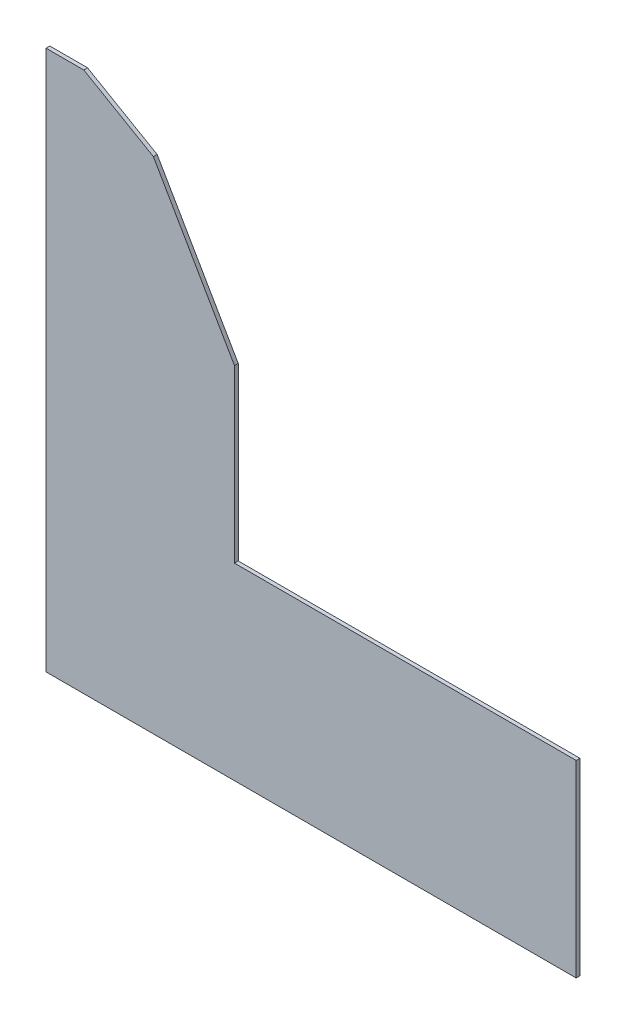
ISO-10303-21;
HEADER;
FILE_DESCRIPTION(('STEP AP214'),'2;1');
FILE_NAME('part.step','',(''),(''),'','','');
FILE_SCHEMA(('AUTOMOTIVE_DESIGN { 1 0 10303 214 1 1 1 1 }'));
ENDSEC;
DATA;
#1=APPLICATION_CONTEXT('core data for automotive mechanical design processes');
#2=APPLICATION_PROTOCOL_DEFINITION('international standard','automotive_design',2000,#1);
#3=PRODUCT_CONTEXT('',#1,'mechanical');
#4=PRODUCT('Part','Part','',(#3));
#5=PRODUCT_RELATED_PRODUCT_CATEGORY('part','',(#4));
#6=PRODUCT_DEFINITION_FORMATION('','',#4);
#7=PRODUCT_DEFINITION_CONTEXT('part definition',#1,'design');
#8=PRODUCT_DEFINITION('design','',#6,#7);
#9=PRODUCT_DEFINITION_SHAPE('','',#8);
#10=(LENGTH_UNIT() NAMED_UNIT(*) SI_UNIT(.MILLI.,.METRE.));
#11=(NAMED_UNIT(*) PLANE_ANGLE_UNIT() SI_UNIT($,.RADIAN.));
#12=(NAMED_UNIT(*) SI_UNIT($,.STERADIAN.) SOLID_ANGLE_UNIT());
#13=UNCERTAINTY_MEASURE_WITH_UNIT(LENGTH_MEASURE(1.E-05),#10,'distance_accuracy_value','');
#14=(GEOMETRIC_REPRESENTATION_CONTEXT(3) GLOBAL_UNCERTAINTY_ASSIGNED_CONTEXT((#13)) GLOBAL_UNIT_ASSIGNED_CONTEXT((#10,
#11,#12)) REPRESENTATION_CONTEXT('',''));
#15=CARTESIAN_POINT('',(0.,0.,0.));
#16=DIRECTION('',(0.,0.,1.));
#17=DIRECTION('',(1.,0.,0.));
#18=AXIS2_PLACEMENT_3D('',#15,#16,#17);
#19=CARTESIAN_POINT('',(0.,0.,1.5));
#20=DIRECTION('',(0.,-1.,0.));
#21=DIRECTION('',(0.,0.,-1.));
#22=AXIS2_PLACEMENT_3D('',#19,#20,#21);
#23=PLANE('',#22);
#24=DIRECTION('',(0.,0.,-1.));
#25=VECTOR('',#24,1.);
#26=CARTESIAN_POINT('',(75.,0.,160.323801742686));
#27=LINE('',#26,#25);
#28=CARTESIAN_POINT('',(75.,0.,1.5));
#29=VERTEX_POINT('',#28);
#30=CARTESIAN_POINT('',(75.,0.,0.));
#31=VERTEX_POINT('',#30);
#32=EDGE_CURVE('E47',#29,#31,#27,.T.);
#33=ORIENTED_EDGE('',*,*,#32,.F.);
#34=DIRECTION('',(-1.,0.,0.));
#35=VECTOR('',#34,1.);
#36=CARTESIAN_POINT('',(0.,0.,1.5));
#37=LINE('',#36,#35);
#38=CARTESIAN_POINT('',(211.,0.,1.5));
#39=VERTEX_POINT('',#38);
#40=EDGE_CURVE('E111',#39,#29,#37,.T.);
#41=ORIENTED_EDGE('',*,*,#40,.F.);
#42=DIRECTION('',(0.,0.,-1.));
#43=VECTOR('',#42,1.);
#44=CARTESIAN_POINT('',(211.,0.,1.5));
#45=LINE('',#44,#43);
#46=CARTESIAN_POINT('',(211.,0.,0.));
#47=VERTEX_POINT('',#46);
#48=EDGE_CURVE('E149',#39,#47,#45,.T.);
#49=ORIENTED_EDGE('',*,*,#48,.T.);
#50=DIRECTION('',(-1.,0.,0.));
#51=VECTOR('',#50,1.);
#52=CARTESIAN_POINT('',(0.,0.,0.));
#53=LINE('',#52,#51);
#54=EDGE_CURVE('E125',#47,#31,#53,.T.);
#55=ORIENTED_EDGE('',*,*,#54,.T.);
#56=EDGE_LOOP('',(#33,#41,#49,#55));
#57=FACE_BOUND('',#56,.T.);
#58=ADVANCED_FACE('F33',(#57),#23,.F.);
#59=CARTESIAN_POINT('',(0.,0.,1.5));
#60=DIRECTION('',(1.,0.,0.));
#61=DIRECTION('',(0.,1.,0.));
#62=AXIS2_PLACEMENT_3D('',#59,#60,#61);
#63=PLANE('',#62);
#64=DIRECTION('',(0.,-1.,0.));
#65=VECTOR('',#64,1.);
#66=CARTESIAN_POINT('',(0.,0.,0.));
#67=LINE('',#66,#65);
#68=CARTESIAN_POINT('',(0.,140.,0.));
#69=VERTEX_POINT('',#68);
#70=CARTESIAN_POINT('',(0.,-75.,0.));
#71=VERTEX_POINT('',#70);
#72=EDGE_CURVE('E127',#69,#71,#67,.T.);
#73=ORIENTED_EDGE('',*,*,#72,.T.);
#74=DIRECTION('',(0.,0.,-1.));
#75=VECTOR('',#74,1.);
#76=CARTESIAN_POINT('',(0.,-75.,1.5));
#77=LINE('',#76,#75);
#78=CARTESIAN_POINT('',(0.,-75.,1.5));
#79=VERTEX_POINT('',#78);
#80=EDGE_CURVE('E11',#79,#71,#77,.T.);
#81=ORIENTED_EDGE('',*,*,#80,.F.);
#82=DIRECTION('',(0.,-1.,0.));
#83=VECTOR('',#82,1.);
#84=CARTESIAN_POINT('',(0.,0.,1.5));
#85=LINE('',#84,#83);
#86=CARTESIAN_POINT('',(0.,140.,1.5));
#87=VERTEX_POINT('',#86);
#88=EDGE_CURVE('E77',#87,#79,#85,.T.);
#89=ORIENTED_EDGE('',*,*,#88,.F.);
#90=DIRECTION('',(0.,0.,-1.));
#91=VECTOR('',#90,1.);
#92=CARTESIAN_POINT('',(0.,140.,160.323801742686));
#93=LINE('',#92,#91);
#94=EDGE_CURVE('E107',#87,#69,#93,.T.);
#95=ORIENTED_EDGE('',*,*,#94,.T.);
#96=EDGE_LOOP('',(#73,#81,#89,#95));
#97=FACE_BOUND('',#96,.T.);
#98=ADVANCED_FACE('F106',(#97),#63,.F.);
#99=CARTESIAN_POINT('',(0.,-75.,1.5));
#100=DIRECTION('',(0.,1.,0.));
#101=DIRECTION('',(-1.,0.,0.));
#102=AXIS2_PLACEMENT_3D('',#99,#100,#101);
#103=PLANE('',#102);
#104=DIRECTION('',(1.,0.,0.));
#105=VECTOR('',#104,1.);
#106=CARTESIAN_POINT('',(0.,-75.,0.));
#107=LINE('',#106,#105);
#108=CARTESIAN_POINT('',(211.,-75.,0.));
#109=VERTEX_POINT('',#108);
#110=EDGE_CURVE('E152',#71,#109,#107,.T.);
#111=ORIENTED_EDGE('',*,*,#110,.T.);
#112=DIRECTION('',(0.,0.,-1.));
#113=VECTOR('',#112,1.);
#114=CARTESIAN_POINT('',(211.,-75.,1.5));
#115=LINE('',#114,#113);
#116=CARTESIAN_POINT('',(211.,-75.,1.5));
#117=VERTEX_POINT('',#116);
#118=EDGE_CURVE('E40',#117,#109,#115,.T.);
#119=ORIENTED_EDGE('',*,*,#118,.F.);
#120=DIRECTION('',(1.,0.,0.));
#121=VECTOR('',#120,1.);
#122=CARTESIAN_POINT('',(0.,-75.,1.5));
#123=LINE('',#122,#121);
#124=EDGE_CURVE('E110',#79,#117,#123,.T.);
#125=ORIENTED_EDGE('',*,*,#124,.F.);
#126=ORIENTED_EDGE('',*,*,#80,.T.);
#127=EDGE_LOOP('',(#111,#119,#125,#126));
#128=FACE_BOUND('',#127,.T.);
#129=ADVANCED_FACE('F179',(#128),#103,.F.);
#130=CARTESIAN_POINT('',(211.,-75.,1.5));
#131=DIRECTION('',(-1.,0.,0.));
#132=DIRECTION('',(0.,0.,1.));
#133=AXIS2_PLACEMENT_3D('',#130,#131,#132);
#134=PLANE('',#133);
#135=DIRECTION('',(0.,1.,0.));
#136=VECTOR('',#135,1.);
#137=CARTESIAN_POINT('',(211.,-75.,0.));
#138=LINE('',#137,#136);
#139=EDGE_CURVE('E72',#109,#47,#138,.T.);
#140=ORIENTED_EDGE('',*,*,#139,.T.);
#141=ORIENTED_EDGE('',*,*,#48,.F.);
#142=DIRECTION('',(0.,1.,0.));
#143=VECTOR('',#142,1.);
#144=CARTESIAN_POINT('',(211.,-75.,1.5));
#145=LINE('',#144,#143);
#146=EDGE_CURVE('E55',#117,#39,#145,.T.);
#147=ORIENTED_EDGE('',*,*,#146,.F.);
#148=ORIENTED_EDGE('',*,*,#118,.T.);
#149=EDGE_LOOP('',(#140,#141,#147,#148));
#150=FACE_BOUND('',#149,.T.);
#151=ADVANCED_FACE('F156',(#150),#134,.F.);
#152=CARTESIAN_POINT('',(0.,0.,1.5));
#153=DIRECTION('',(0.,0.,1.));
#154=DIRECTION('',(1.,0.,0.));
#155=AXIS2_PLACEMENT_3D('',#152,#153,#154);
#156=PLANE('',#155);
#157=ORIENTED_EDGE('',*,*,#40,.T.);
#158=DIRECTION('',(0.,1.,0.));
#159=VECTOR('',#158,1.);
#160=CARTESIAN_POINT('',(75.,68.076951545867,1.5));
#161=LINE('',#160,#159);
#162=CARTESIAN_POINT('',(75.,68.076951545867,1.5));
#163=VERTEX_POINT('',#162);
#164=EDGE_CURVE('E119',#29,#163,#161,.T.);
#165=ORIENTED_EDGE('',*,*,#164,.T.);
#166=DIRECTION('',(-0.499999999999998,0.86602540378444,0.));
#167=VECTOR('',#166,1.);
#168=CARTESIAN_POINT('',(42.712812921102,124.,1.5));
#169=LINE('',#168,#167);
#170=CARTESIAN_POINT('',(42.712812921102,124.,1.5));
#171=VERTEX_POINT('',#170);
#172=EDGE_CURVE('E129',#163,#171,#169,.T.);
#173=ORIENTED_EDGE('',*,*,#172,.T.);
#174=DIRECTION('',(-0.866025403784438,0.500000000000001,0.));
#175=VECTOR('',#174,1.);
#176=CARTESIAN_POINT('',(15.,140.,1.5));
#177=LINE('',#176,#175);
#178=CARTESIAN_POINT('',(15.,140.,1.5));
#179=VERTEX_POINT('',#178);
#180=EDGE_CURVE('E124',#171,#179,#177,.T.);
#181=ORIENTED_EDGE('',*,*,#180,.T.);
#182=DIRECTION('',(-1.,0.,0.));
#183=VECTOR('',#182,1.);
#184=CARTESIAN_POINT('',(0.,140.,1.5));
#185=LINE('',#184,#183);
#186=EDGE_CURVE('E115',#179,#87,#185,.T.);
#187=ORIENTED_EDGE('',*,*,#186,.T.);
#188=ORIENTED_EDGE('',*,*,#88,.T.);
#189=ORIENTED_EDGE('',*,*,#124,.T.);
#190=ORIENTED_EDGE('',*,*,#146,.T.);
#191=EDGE_LOOP('',(#157,#165,#173,#181,#187,#188,#189,#190));
#192=FACE_BOUND('',#191,.T.);
#193=ADVANCED_FACE('F122',(#192),#156,.T.);
#194=CARTESIAN_POINT('',(0.,0.,0.));
#195=DIRECTION('',(0.,0.,1.));
#196=DIRECTION('',(1.,0.,0.));
#197=AXIS2_PLACEMENT_3D('',#194,#195,#196);
#198=PLANE('',#197);
#199=ORIENTED_EDGE('',*,*,#54,.F.);
#200=ORIENTED_EDGE('',*,*,#139,.F.);
#201=ORIENTED_EDGE('',*,*,#110,.F.);
#202=ORIENTED_EDGE('',*,*,#72,.F.);
#203=DIRECTION('',(-1.,0.,0.));
#204=VECTOR('',#203,1.);
#205=CARTESIAN_POINT('',(0.,140.,0.));
#206=LINE('',#205,#204);
#207=CARTESIAN_POINT('',(15.,140.,0.));
#208=VERTEX_POINT('',#207);
#209=EDGE_CURVE('E118',#208,#69,#206,.T.);
#210=ORIENTED_EDGE('',*,*,#209,.F.);
#211=DIRECTION('',(-0.866025403784438,0.500000000000001,0.));
#212=VECTOR('',#211,1.);
#213=CARTESIAN_POINT('',(15.,140.,0.));
#214=LINE('',#213,#212);
#215=CARTESIAN_POINT('',(42.712812921102,124.,0.));
#216=VERTEX_POINT('',#215);
#217=EDGE_CURVE('E144',#216,#208,#214,.T.);
#218=ORIENTED_EDGE('',*,*,#217,.F.);
#219=DIRECTION('',(-0.499999999999998,0.86602540378444,0.));
#220=VECTOR('',#219,1.);
#221=CARTESIAN_POINT('',(42.712812921102,124.,0.));
#222=LINE('',#221,#220);
#223=CARTESIAN_POINT('',(75.,68.076951545867,0.));
#224=VERTEX_POINT('',#223);
#225=EDGE_CURVE('E141',#224,#216,#222,.T.);
#226=ORIENTED_EDGE('',*,*,#225,.F.);
#227=DIRECTION('',(0.,1.,0.));
#228=VECTOR('',#227,1.);
#229=CARTESIAN_POINT('',(75.,68.076951545867,0.));
#230=LINE('',#229,#228);
#231=EDGE_CURVE('E132',#31,#224,#230,.T.);
#232=ORIENTED_EDGE('',*,*,#231,.F.);
#233=EDGE_LOOP('',(#199,#200,#201,#202,#210,#218,#226,#232));
#234=FACE_BOUND('',#233,.T.);
#235=ADVANCED_FACE('F161',(#234),#198,.F.);
#236=CARTESIAN_POINT('',(75.,68.076951545867,160.323801742686));
#237=DIRECTION('',(-1.,0.,0.));
#238=DIRECTION('',(0.,-1.,0.));
#239=AXIS2_PLACEMENT_3D('',#236,#237,#238);
#240=PLANE('',#239);
#241=ORIENTED_EDGE('',*,*,#164,.F.);
#242=ORIENTED_EDGE('',*,*,#32,.T.);
#243=ORIENTED_EDGE('',*,*,#231,.T.);
#244=DIRECTION('',(0.,0.,-1.));
#245=VECTOR('',#244,1.);
#246=CARTESIAN_POINT('',(75.,68.076951545867,160.323801742686));
#247=LINE('',#246,#245);
#248=EDGE_CURVE('E139',#163,#224,#247,.T.);
#249=ORIENTED_EDGE('',*,*,#248,.F.);
#250=EDGE_LOOP('',(#241,#242,#243,#249));
#251=FACE_BOUND('',#250,.T.);
#252=ADVANCED_FACE('F167',(#251),#240,.F.);
#253=CARTESIAN_POINT('',(42.712812921102,124.,160.323801742686));
#254=DIRECTION('',(-0.86602540378444,-0.499999999999998,0.));
#255=DIRECTION('',(0.499999999999998,-0.86602540378444,0.));
#256=AXIS2_PLACEMENT_3D('',#253,#254,#255);
#257=PLANE('',#256);
#258=ORIENTED_EDGE('',*,*,#172,.F.);
#259=ORIENTED_EDGE('',*,*,#248,.T.);
#260=ORIENTED_EDGE('',*,*,#225,.T.);
#261=DIRECTION('',(0.,0.,-1.));
#262=VECTOR('',#261,1.);
#263=CARTESIAN_POINT('',(42.712812921102,124.,160.323801742686));
#264=LINE('',#263,#262);
#265=EDGE_CURVE('E142',#171,#216,#264,.T.);
#266=ORIENTED_EDGE('',*,*,#265,.F.);
#267=EDGE_LOOP('',(#258,#259,#260,#266));
#268=FACE_BOUND('',#267,.T.);
#269=ADVANCED_FACE('F171',(#268),#257,.F.);
#270=CARTESIAN_POINT('',(15.,140.,160.323801742686));
#271=DIRECTION('',(-0.500000000000001,-0.866025403784438,0.));
#272=DIRECTION('',(0.866025403784438,-0.500000000000001,0.));
#273=AXIS2_PLACEMENT_3D('',#270,#271,#272);
#274=PLANE('',#273);
#275=ORIENTED_EDGE('',*,*,#180,.F.);
#276=ORIENTED_EDGE('',*,*,#265,.T.);
#277=ORIENTED_EDGE('',*,*,#217,.T.);
#278=DIRECTION('',(0.,0.,-1.));
#279=VECTOR('',#278,1.);
#280=CARTESIAN_POINT('',(15.,140.,160.323801742686));
#281=LINE('',#280,#279);
#282=EDGE_CURVE('E145',#179,#208,#281,.T.);
#283=ORIENTED_EDGE('',*,*,#282,.F.);
#284=EDGE_LOOP('',(#275,#276,#277,#283));
#285=FACE_BOUND('',#284,.T.);
#286=ADVANCED_FACE('F176',(#285),#274,.F.);
#287=CARTESIAN_POINT('',(0.,140.,160.323801742686));
#288=DIRECTION('',(0.,-1.,0.));
#289=DIRECTION('',(0.,0.,-1.));
#290=AXIS2_PLACEMENT_3D('',#287,#288,#289);
#291=PLANE('',#290);
#292=ORIENTED_EDGE('',*,*,#186,.F.);
#293=ORIENTED_EDGE('',*,*,#282,.T.);
#294=ORIENTED_EDGE('',*,*,#209,.T.);
#295=ORIENTED_EDGE('',*,*,#94,.F.);
#296=EDGE_LOOP('',(#292,#293,#294,#295));
#297=FACE_BOUND('',#296,.T.);
#298=ADVANCED_FACE('F114',(#297),#291,.F.);
#299=CLOSED_SHELL('',(#58,#98,#129,#151,#193,#235,#252,#269,#286,#298));
#300=MANIFOLD_SOLID_BREP('B2',#299);
#301=ADVANCED_BREP_SHAPE_REPRESENTATION('',(#18,#300),#14);
#302=SHAPE_DEFINITION_REPRESENTATION(#9,#301);
ENDSEC;
END-ISO-10303-21;
